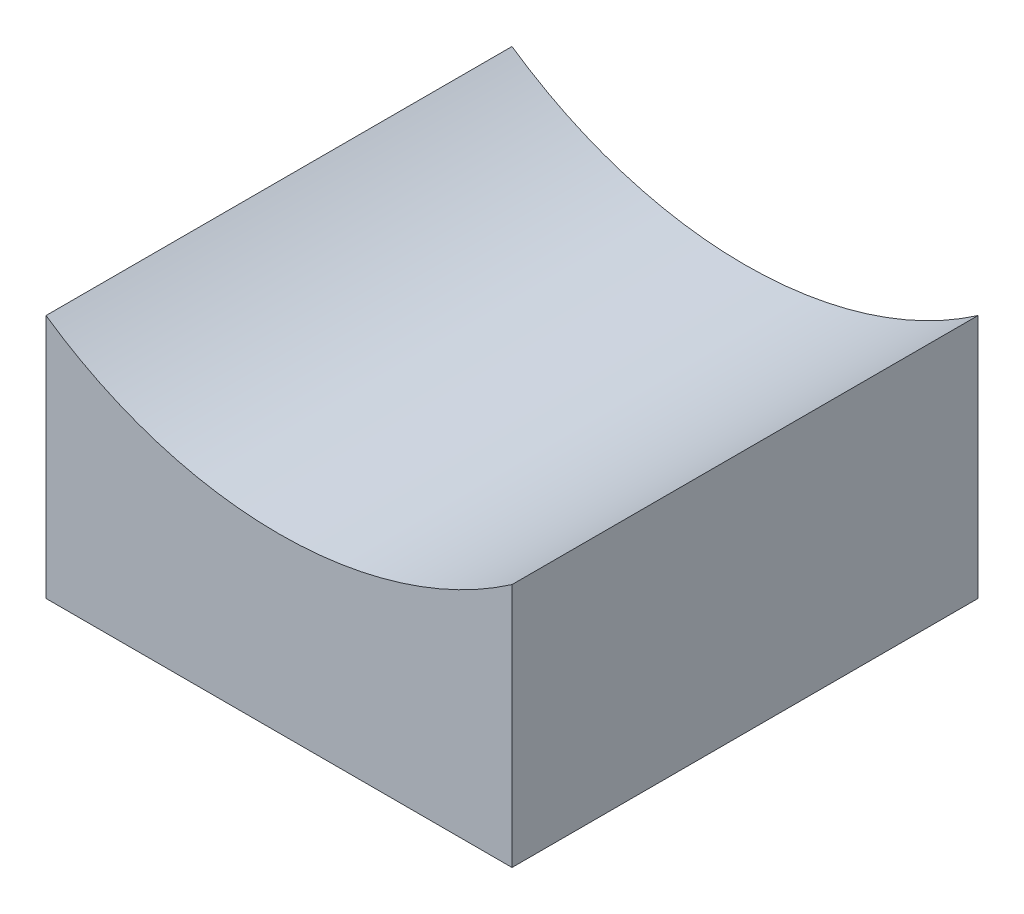
ISO-10303-21;
HEADER;
FILE_DESCRIPTION(('STEP AP214'),'2;1');
FILE_NAME('part.step','',(''),(''),'','','');
FILE_SCHEMA(('AUTOMOTIVE_DESIGN { 1 0 10303 214 1 1 1 1 }'));
ENDSEC;
DATA;
#1=APPLICATION_CONTEXT('core data for automotive mechanical design processes');
#2=APPLICATION_PROTOCOL_DEFINITION('international standard','automotive_design',2000,#1);
#3=PRODUCT_CONTEXT('',#1,'mechanical');
#4=PRODUCT('Part','Part','',(#3));
#5=PRODUCT_RELATED_PRODUCT_CATEGORY('part','',(#4));
#6=PRODUCT_DEFINITION_FORMATION('','',#4);
#7=PRODUCT_DEFINITION_CONTEXT('part definition',#1,'design');
#8=PRODUCT_DEFINITION('design','',#6,#7);
#9=PRODUCT_DEFINITION_SHAPE('','',#8);
#10=(LENGTH_UNIT() NAMED_UNIT(*) SI_UNIT(.MILLI.,.METRE.));
#11=(NAMED_UNIT(*) PLANE_ANGLE_UNIT() SI_UNIT($,.RADIAN.));
#12=(NAMED_UNIT(*) SI_UNIT($,.STERADIAN.) SOLID_ANGLE_UNIT());
#13=UNCERTAINTY_MEASURE_WITH_UNIT(LENGTH_MEASURE(1.E-05),#10,'distance_accuracy_value','');
#14=(GEOMETRIC_REPRESENTATION_CONTEXT(3) GLOBAL_UNCERTAINTY_ASSIGNED_CONTEXT((#13)) GLOBAL_UNIT_ASSIGNED_CONTEXT((#10,
#11,#12)) REPRESENTATION_CONTEXT('',''));
#15=CARTESIAN_POINT('',(0.,0.,0.));
#16=DIRECTION('',(0.,0.,1.));
#17=DIRECTION('',(1.,0.,0.));
#18=AXIS2_PLACEMENT_3D('',#15,#16,#17);
#19=CARTESIAN_POINT('',(0.,31.75,25.4));
#20=DIRECTION('',(0.,0.,-1.));
#21=DIRECTION('',(-1.,0.,0.));
#22=AXIS2_PLACEMENT_3D('',#19,#20,#21);
#23=CYLINDRICAL_SURFACE('',#22,22.352);
#24=CARTESIAN_POINT('',(0.,31.75,0.));
#25=DIRECTION('',(0.,0.,-1.));
#26=DIRECTION('',(1.,0.,0.));
#27=AXIS2_PLACEMENT_3D('',#24,#25,#26);
#28=CIRCLE('',#27,22.352);
#29=CARTESIAN_POINT('',(12.7,13.3564711379246,0.));
#30=VERTEX_POINT('',#29);
#31=CARTESIAN_POINT('',(-12.7,13.3564711379246,0.));
#32=VERTEX_POINT('',#31);
#33=EDGE_CURVE('E96',#30,#32,#28,.T.);
#34=ORIENTED_EDGE('',*,*,#33,.T.);
#35=DIRECTION('',(0.,0.,-1.));
#36=VECTOR('',#35,1.);
#37=CARTESIAN_POINT('',(-12.7,13.3564711379246,25.4));
#38=LINE('',#37,#36);
#39=CARTESIAN_POINT('',(-12.7,13.3564711379246,25.4));
#40=VERTEX_POINT('',#39);
#41=EDGE_CURVE('E11',#40,#32,#38,.T.);
#42=ORIENTED_EDGE('',*,*,#41,.F.);
#43=CARTESIAN_POINT('',(0.,31.75,25.4));
#44=DIRECTION('',(0.,0.,-1.));
#45=DIRECTION('',(1.,0.,0.));
#46=AXIS2_PLACEMENT_3D('',#43,#44,#45);
#47=CIRCLE('',#46,22.352);
#48=CARTESIAN_POINT('',(12.7,13.3564711379246,25.4));
#49=VERTEX_POINT('',#48);
#50=EDGE_CURVE('E84',#49,#40,#47,.T.);
#51=ORIENTED_EDGE('',*,*,#50,.F.);
#52=DIRECTION('',(0.,0.,-1.));
#53=VECTOR('',#52,1.);
#54=CARTESIAN_POINT('',(12.7,13.3564711379246,25.4));
#55=LINE('',#54,#53);
#56=EDGE_CURVE('E92',#49,#30,#55,.T.);
#57=ORIENTED_EDGE('',*,*,#56,.T.);
#58=EDGE_LOOP('',(#34,#42,#51,#57));
#59=FACE_BOUND('',#58,.T.);
#60=ADVANCED_FACE('F33',(#59),#23,.F.);
#61=CARTESIAN_POINT('',(-12.7,0.,25.4));
#62=DIRECTION('',(1.,0.,0.));
#63=DIRECTION('',(0.,0.,-1.));
#64=AXIS2_PLACEMENT_3D('',#61,#62,#63);
#65=PLANE('',#64);
#66=DIRECTION('',(0.,-1.,0.));
#67=VECTOR('',#66,1.);
#68=CARTESIAN_POINT('',(-12.7,0.,0.));
#69=LINE('',#68,#67);
#70=CARTESIAN_POINT('',(-12.7,0.,0.));
#71=VERTEX_POINT('',#70);
#72=EDGE_CURVE('E88',#32,#71,#69,.T.);
#73=ORIENTED_EDGE('',*,*,#72,.T.);
#74=DIRECTION('',(0.,0.,-1.));
#75=VECTOR('',#74,1.);
#76=CARTESIAN_POINT('',(-12.7,0.,25.4));
#77=LINE('',#76,#75);
#78=CARTESIAN_POINT('',(-12.7,0.,25.4));
#79=VERTEX_POINT('',#78);
#80=EDGE_CURVE('E41',#79,#71,#77,.T.);
#81=ORIENTED_EDGE('',*,*,#80,.F.);
#82=DIRECTION('',(0.,-1.,0.));
#83=VECTOR('',#82,1.);
#84=CARTESIAN_POINT('',(-12.7,0.,25.4));
#85=LINE('',#84,#83);
#86=EDGE_CURVE('E79',#40,#79,#85,.T.);
#87=ORIENTED_EDGE('',*,*,#86,.F.);
#88=ORIENTED_EDGE('',*,*,#41,.T.);
#89=EDGE_LOOP('',(#73,#81,#87,#88));
#90=FACE_BOUND('',#89,.T.);
#91=ADVANCED_FACE('F87',(#90),#65,.F.);
#92=CARTESIAN_POINT('',(12.7,0.,25.4));
#93=DIRECTION('',(0.,1.,0.));
#94=DIRECTION('',(-1.,0.,0.));
#95=AXIS2_PLACEMENT_3D('',#92,#93,#94);
#96=PLANE('',#95);
#97=DIRECTION('',(1.,0.,0.));
#98=VECTOR('',#97,1.);
#99=CARTESIAN_POINT('',(12.7,0.,0.));
#100=LINE('',#99,#98);
#101=CARTESIAN_POINT('',(12.7,0.,0.));
#102=VERTEX_POINT('',#101);
#103=EDGE_CURVE('E66',#71,#102,#100,.T.);
#104=ORIENTED_EDGE('',*,*,#103,.T.);
#105=DIRECTION('',(0.,0.,-1.));
#106=VECTOR('',#105,1.);
#107=CARTESIAN_POINT('',(12.7,0.,25.4));
#108=LINE('',#107,#106);
#109=CARTESIAN_POINT('',(12.7,0.,25.4));
#110=VERTEX_POINT('',#109);
#111=EDGE_CURVE('E89',#110,#102,#108,.T.);
#112=ORIENTED_EDGE('',*,*,#111,.F.);
#113=DIRECTION('',(1.,0.,0.));
#114=VECTOR('',#113,1.);
#115=CARTESIAN_POINT('',(12.7,0.,25.4));
#116=LINE('',#115,#114);
#117=EDGE_CURVE('E82',#79,#110,#116,.T.);
#118=ORIENTED_EDGE('',*,*,#117,.F.);
#119=ORIENTED_EDGE('',*,*,#80,.T.);
#120=EDGE_LOOP('',(#104,#112,#118,#119));
#121=FACE_BOUND('',#120,.T.);
#122=ADVANCED_FACE('F90',(#121),#96,.F.);
#123=CARTESIAN_POINT('',(12.7,0.,25.4));
#124=DIRECTION('',(-1.,0.,0.));
#125=DIRECTION('',(0.,-1.,0.));
#126=AXIS2_PLACEMENT_3D('',#123,#124,#125);
#127=PLANE('',#126);
#128=DIRECTION('',(0.,1.,0.));
#129=VECTOR('',#128,1.);
#130=CARTESIAN_POINT('',(12.7,0.,0.));
#131=LINE('',#130,#129);
#132=EDGE_CURVE('E72',#102,#30,#131,.T.);
#133=ORIENTED_EDGE('',*,*,#132,.T.);
#134=ORIENTED_EDGE('',*,*,#56,.F.);
#135=DIRECTION('',(0.,1.,0.));
#136=VECTOR('',#135,1.);
#137=CARTESIAN_POINT('',(12.7,0.,25.4));
#138=LINE('',#137,#136);
#139=EDGE_CURVE('E49',#110,#49,#138,.T.);
#140=ORIENTED_EDGE('',*,*,#139,.F.);
#141=ORIENTED_EDGE('',*,*,#111,.T.);
#142=EDGE_LOOP('',(#133,#134,#140,#141));
#143=FACE_BOUND('',#142,.T.);
#144=ADVANCED_FACE('F103',(#143),#127,.F.);
#145=CARTESIAN_POINT('',(0.,31.75,25.4));
#146=DIRECTION('',(0.,0.,1.));
#147=DIRECTION('',(1.,0.,0.));
#148=AXIS2_PLACEMENT_3D('',#145,#146,#147);
#149=PLANE('',#148);
#150=ORIENTED_EDGE('',*,*,#50,.T.);
#151=ORIENTED_EDGE('',*,*,#86,.T.);
#152=ORIENTED_EDGE('',*,*,#117,.T.);
#153=ORIENTED_EDGE('',*,*,#139,.T.);
#154=EDGE_LOOP('',(#150,#151,#152,#153));
#155=FACE_BOUND('',#154,.T.);
#156=ADVANCED_FACE('F80',(#155),#149,.T.);
#157=CARTESIAN_POINT('',(0.,31.75,0.));
#158=DIRECTION('',(0.,0.,1.));
#159=DIRECTION('',(1.,0.,0.));
#160=AXIS2_PLACEMENT_3D('',#157,#158,#159);
#161=PLANE('',#160);
#162=ORIENTED_EDGE('',*,*,#33,.F.);
#163=ORIENTED_EDGE('',*,*,#132,.F.);
#164=ORIENTED_EDGE('',*,*,#103,.F.);
#165=ORIENTED_EDGE('',*,*,#72,.F.);
#166=EDGE_LOOP('',(#162,#163,#164,#165));
#167=FACE_BOUND('',#166,.T.);
#168=ADVANCED_FACE('F106',(#167),#161,.F.);
#169=CLOSED_SHELL('',(#60,#91,#122,#144,#156,#168));
#170=MANIFOLD_SOLID_BREP('B2',#169);
#171=ADVANCED_BREP_SHAPE_REPRESENTATION('',(#18,#170),#14);
#172=SHAPE_DEFINITION_REPRESENTATION(#9,#171);
ENDSEC;
END-ISO-10303-21;
